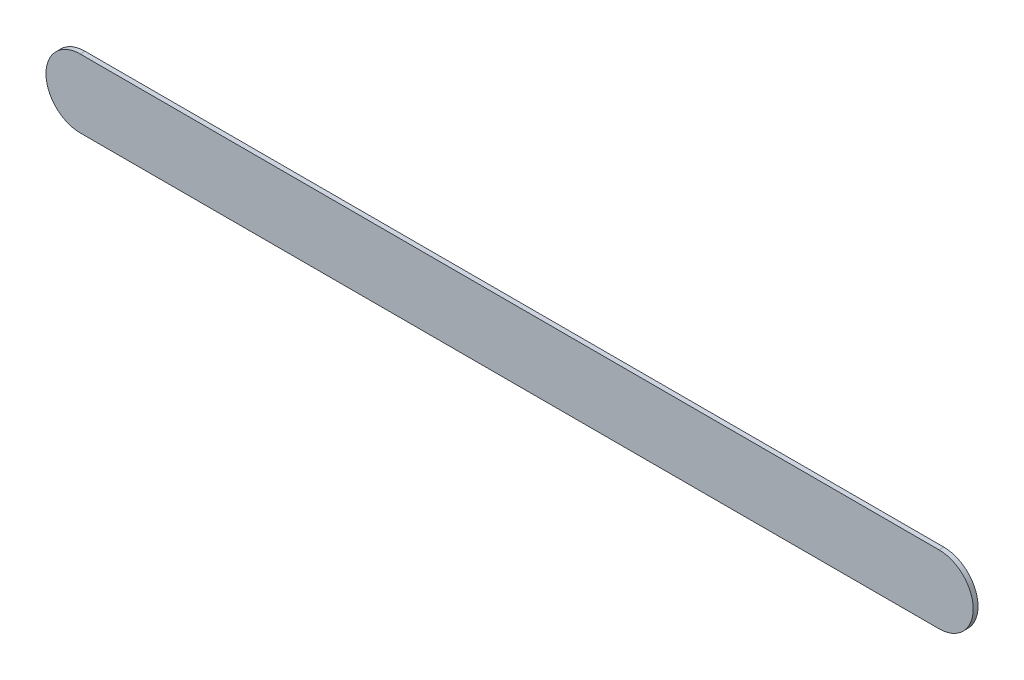
ISO-10303-21;
HEADER;
FILE_DESCRIPTION(('STEP AP214'),'2;1');
FILE_NAME('part.step','',(''),(''),'','','');
FILE_SCHEMA(('AUTOMOTIVE_DESIGN { 1 0 10303 214 1 1 1 1 }'));
ENDSEC;
DATA;
#1=APPLICATION_CONTEXT('core data for automotive mechanical design processes');
#2=APPLICATION_PROTOCOL_DEFINITION('international standard','automotive_design',2000,#1);
#3=PRODUCT_CONTEXT('',#1,'mechanical');
#4=PRODUCT('Part','Part','',(#3));
#5=PRODUCT_RELATED_PRODUCT_CATEGORY('part','',(#4));
#6=PRODUCT_DEFINITION_FORMATION('','',#4);
#7=PRODUCT_DEFINITION_CONTEXT('part definition',#1,'design');
#8=PRODUCT_DEFINITION('design','',#6,#7);
#9=PRODUCT_DEFINITION_SHAPE('','',#8);
#10=(LENGTH_UNIT() NAMED_UNIT(*) SI_UNIT(.MILLI.,.METRE.));
#11=(NAMED_UNIT(*) PLANE_ANGLE_UNIT() SI_UNIT($,.RADIAN.));
#12=(NAMED_UNIT(*) SI_UNIT($,.STERADIAN.) SOLID_ANGLE_UNIT());
#13=UNCERTAINTY_MEASURE_WITH_UNIT(LENGTH_MEASURE(1.E-05),#10,'distance_accuracy_value','');
#14=(GEOMETRIC_REPRESENTATION_CONTEXT(3) GLOBAL_UNCERTAINTY_ASSIGNED_CONTEXT((#13)) GLOBAL_UNIT_ASSIGNED_CONTEXT((#10,
#11,#12)) REPRESENTATION_CONTEXT('',''));
#15=CARTESIAN_POINT('',(0.,0.,0.));
#16=DIRECTION('',(0.,0.,1.));
#17=DIRECTION('',(1.,0.,0.));
#18=AXIS2_PLACEMENT_3D('',#15,#16,#17);
#19=CARTESIAN_POINT('',(105.89,-55.56,1.635));
#20=DIRECTION('',(0.,0.,1.));
#21=DIRECTION('',(1.,0.,0.));
#22=AXIS2_PLACEMENT_3D('',#19,#20,#21);
#23=PLANE('',#22);
#24=DIRECTION('',(1.,0.,0.));
#25=VECTOR('',#24,1.);
#26=CARTESIAN_POINT('',(105.89,-55.56,1.635));
#27=LINE('',#26,#25);
#28=CARTESIAN_POINT('',(105.89,-55.56,1.635));
#29=VERTEX_POINT('',#28);
#30=CARTESIAN_POINT('',(112.17,-55.56,1.635));
#31=VERTEX_POINT('',#30);
#32=EDGE_CURVE('E74',#29,#31,#27,.T.);
#33=ORIENTED_EDGE('',*,*,#32,.T.);
#34=CARTESIAN_POINT('',(112.17,-55.31,1.635));
#35=DIRECTION('',(0.,0.,1.));
#36=DIRECTION('',(0.,-1.,0.));
#37=AXIS2_PLACEMENT_3D('',#34,#35,#36);
#38=CIRCLE('',#37,0.25);
#39=CARTESIAN_POINT('',(112.17,-55.06,1.635));
#40=VERTEX_POINT('',#39);
#41=EDGE_CURVE('E109',#31,#40,#38,.T.);
#42=ORIENTED_EDGE('',*,*,#41,.T.);
#43=DIRECTION('',(-1.,0.,0.));
#44=VECTOR('',#43,1.);
#45=CARTESIAN_POINT('',(112.17,-55.06,1.635));
#46=LINE('',#45,#44);
#47=CARTESIAN_POINT('',(105.89,-55.06,1.635));
#48=VERTEX_POINT('',#47);
#49=EDGE_CURVE('E76',#40,#48,#46,.T.);
#50=ORIENTED_EDGE('',*,*,#49,.T.);
#51=CARTESIAN_POINT('',(105.89,-55.31,1.635));
#52=DIRECTION('',(0.,0.,1.));
#53=DIRECTION('',(0.,1.,0.));
#54=AXIS2_PLACEMENT_3D('',#51,#52,#53);
#55=CIRCLE('',#54,0.25);
#56=EDGE_CURVE('E11',#48,#29,#55,.T.);
#57=ORIENTED_EDGE('',*,*,#56,.T.);
#58=EDGE_LOOP('',(#33,#42,#50,#57));
#59=FACE_BOUND('',#58,.T.);
#60=ADVANCED_FACE('F17',(#59),#23,.T.);
#61=CARTESIAN_POINT('',(105.89,-55.56,1.6));
#62=DIRECTION('',(0.,0.,1.));
#63=DIRECTION('',(1.,0.,0.));
#64=AXIS2_PLACEMENT_3D('',#61,#62,#63);
#65=PLANE('',#64);
#66=CARTESIAN_POINT('',(105.89,-55.31,1.6));
#67=DIRECTION('',(0.,0.,1.));
#68=DIRECTION('',(0.,1.,0.));
#69=AXIS2_PLACEMENT_3D('',#66,#67,#68);
#70=CIRCLE('',#69,0.25);
#71=CARTESIAN_POINT('',(105.89,-55.06,1.6));
#72=VERTEX_POINT('',#71);
#73=CARTESIAN_POINT('',(105.89,-55.56,1.6));
#74=VERTEX_POINT('',#73);
#75=EDGE_CURVE('E20',#72,#74,#70,.T.);
#76=ORIENTED_EDGE('',*,*,#75,.F.);
#77=DIRECTION('',(-1.,0.,0.));
#78=VECTOR('',#77,1.);
#79=CARTESIAN_POINT('',(112.17,-55.06,1.6));
#80=LINE('',#79,#78);
#81=CARTESIAN_POINT('',(112.17,-55.06,1.6));
#82=VERTEX_POINT('',#81);
#83=EDGE_CURVE('E65',#82,#72,#80,.T.);
#84=ORIENTED_EDGE('',*,*,#83,.F.);
#85=CARTESIAN_POINT('',(112.17,-55.31,1.6));
#86=DIRECTION('',(0.,0.,1.));
#87=DIRECTION('',(0.,-1.,0.));
#88=AXIS2_PLACEMENT_3D('',#85,#86,#87);
#89=CIRCLE('',#88,0.25);
#90=CARTESIAN_POINT('',(112.17,-55.56,1.6));
#91=VERTEX_POINT('',#90);
#92=EDGE_CURVE('E84',#91,#82,#89,.T.);
#93=ORIENTED_EDGE('',*,*,#92,.F.);
#94=DIRECTION('',(1.,0.,0.));
#95=VECTOR('',#94,1.);
#96=CARTESIAN_POINT('',(105.89,-55.56,1.6));
#97=LINE('',#96,#95);
#98=EDGE_CURVE('E95',#74,#91,#97,.T.);
#99=ORIENTED_EDGE('',*,*,#98,.F.);
#100=EDGE_LOOP('',(#76,#84,#93,#99));
#101=FACE_BOUND('',#100,.T.);
#102=ADVANCED_FACE('F160',(#101),#65,.F.);
#103=CARTESIAN_POINT('',(105.89,-55.31,1.6));
#104=DIRECTION('',(0.,0.,-1.));
#105=DIRECTION('',(0.,1.,0.));
#106=AXIS2_PLACEMENT_3D('',#103,#104,#105);
#107=CYLINDRICAL_SURFACE('',#106,0.25);
#108=ORIENTED_EDGE('',*,*,#75,.T.);
#109=DIRECTION('',(0.,0.,1.));
#110=VECTOR('',#109,1.);
#111=CARTESIAN_POINT('',(105.89,-55.56,1.6));
#112=LINE('',#111,#110);
#113=EDGE_CURVE('E79',#74,#29,#112,.T.);
#114=ORIENTED_EDGE('',*,*,#113,.T.);
#115=ORIENTED_EDGE('',*,*,#56,.F.);
#116=DIRECTION('',(0.,0.,1.));
#117=VECTOR('',#116,1.);
#118=CARTESIAN_POINT('',(105.89,-55.06,1.6));
#119=LINE('',#118,#117);
#120=EDGE_CURVE('E99',#72,#48,#119,.T.);
#121=ORIENTED_EDGE('',*,*,#120,.F.);
#122=EDGE_LOOP('',(#108,#114,#115,#121));
#123=FACE_BOUND('',#122,.T.);
#124=ADVANCED_FACE('F80',(#123),#107,.T.);
#125=CARTESIAN_POINT('',(112.17,-55.06,1.6));
#126=DIRECTION('',(0.,-1.,0.));
#127=DIRECTION('',(0.,0.,-1.));
#128=AXIS2_PLACEMENT_3D('',#125,#126,#127);
#129=PLANE('',#128);
#130=ORIENTED_EDGE('',*,*,#83,.T.);
#131=ORIENTED_EDGE('',*,*,#120,.T.);
#132=ORIENTED_EDGE('',*,*,#49,.F.);
#133=DIRECTION('',(0.,0.,1.));
#134=VECTOR('',#133,1.);
#135=CARTESIAN_POINT('',(112.17,-55.06,1.6));
#136=LINE('',#135,#134);
#137=EDGE_CURVE('E105',#82,#40,#136,.T.);
#138=ORIENTED_EDGE('',*,*,#137,.F.);
#139=EDGE_LOOP('',(#130,#131,#132,#138));
#140=FACE_BOUND('',#139,.T.);
#141=ADVANCED_FACE('F141',(#140),#129,.F.);
#142=CARTESIAN_POINT('',(112.17,-55.31,1.6));
#143=DIRECTION('',(0.,0.,-1.));
#144=DIRECTION('',(0.,-1.,0.));
#145=AXIS2_PLACEMENT_3D('',#142,#143,#144);
#146=CYLINDRICAL_SURFACE('',#145,0.25);
#147=ORIENTED_EDGE('',*,*,#92,.T.);
#148=ORIENTED_EDGE('',*,*,#137,.T.);
#149=ORIENTED_EDGE('',*,*,#41,.F.);
#150=DIRECTION('',(0.,0.,1.));
#151=VECTOR('',#150,1.);
#152=CARTESIAN_POINT('',(112.17,-55.56,1.6));
#153=LINE('',#152,#151);
#154=EDGE_CURVE('E88',#91,#31,#153,.T.);
#155=ORIENTED_EDGE('',*,*,#154,.F.);
#156=EDGE_LOOP('',(#147,#148,#149,#155));
#157=FACE_BOUND('',#156,.T.);
#158=ADVANCED_FACE('F131',(#157),#146,.T.);
#159=CARTESIAN_POINT('',(105.89,-55.56,1.6));
#160=DIRECTION('',(0.,1.,0.));
#161=DIRECTION('',(1.,0.,0.));
#162=AXIS2_PLACEMENT_3D('',#159,#160,#161);
#163=PLANE('',#162);
#164=ORIENTED_EDGE('',*,*,#98,.T.);
#165=ORIENTED_EDGE('',*,*,#154,.T.);
#166=ORIENTED_EDGE('',*,*,#32,.F.);
#167=ORIENTED_EDGE('',*,*,#113,.F.);
#168=EDGE_LOOP('',(#164,#165,#166,#167));
#169=FACE_BOUND('',#168,.T.);
#170=ADVANCED_FACE('F86',(#169),#163,.F.);
#171=CLOSED_SHELL('',(#60,#102,#124,#141,#158,#170));
#172=MANIFOLD_SOLID_BREP('B1',#171);
#173=ADVANCED_BREP_SHAPE_REPRESENTATION('',(#18,#172),#14);
#174=SHAPE_DEFINITION_REPRESENTATION(#9,#173);
ENDSEC;
END-ISO-10303-21;
